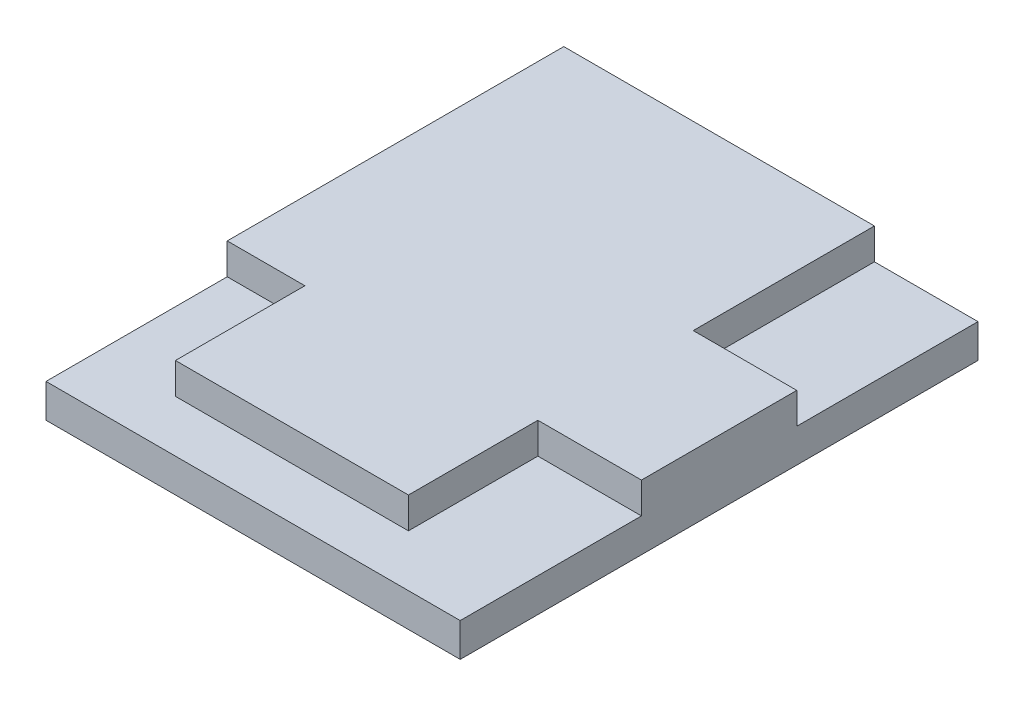
ISO-10303-21;
HEADER;
FILE_DESCRIPTION(('STEP AP214'),'2;1');
FILE_NAME('part.step','',(''),(''),'','','');
FILE_SCHEMA(('AUTOMOTIVE_DESIGN { 1 0 10303 214 1 1 1 1 }'));
ENDSEC;
DATA;
#1=APPLICATION_CONTEXT('core data for automotive mechanical design processes');
#2=APPLICATION_PROTOCOL_DEFINITION('international standard','automotive_design',2000,#1);
#3=PRODUCT_CONTEXT('',#1,'mechanical');
#4=PRODUCT('Part','Part','',(#3));
#5=PRODUCT_RELATED_PRODUCT_CATEGORY('part','',(#4));
#6=PRODUCT_DEFINITION_FORMATION('','',#4);
#7=PRODUCT_DEFINITION_CONTEXT('part definition',#1,'design');
#8=PRODUCT_DEFINITION('design','',#6,#7);
#9=PRODUCT_DEFINITION_SHAPE('','',#8);
#10=(LENGTH_UNIT() NAMED_UNIT(*) SI_UNIT(.MILLI.,.METRE.));
#11=(NAMED_UNIT(*) PLANE_ANGLE_UNIT() SI_UNIT($,.RADIAN.));
#12=(NAMED_UNIT(*) SI_UNIT($,.STERADIAN.) SOLID_ANGLE_UNIT());
#13=UNCERTAINTY_MEASURE_WITH_UNIT(LENGTH_MEASURE(1.E-05),#10,'distance_accuracy_value','');
#14=(GEOMETRIC_REPRESENTATION_CONTEXT(3) GLOBAL_UNCERTAINTY_ASSIGNED_CONTEXT((#13)) GLOBAL_UNIT_ASSIGNED_CONTEXT((#10,
#11,#12)) REPRESENTATION_CONTEXT('',''));
#15=CARTESIAN_POINT('',(0.,0.,0.));
#16=DIRECTION('',(0.,0.,1.));
#17=DIRECTION('',(1.,0.,0.));
#18=AXIS2_PLACEMENT_3D('',#15,#16,#17);
#19=CARTESIAN_POINT('',(0.,1.3,0.));
#20=DIRECTION('',(0.,-1.,0.));
#21=DIRECTION('',(0.,0.,-1.));
#22=AXIS2_PLACEMENT_3D('',#19,#20,#21);
#23=PLANE('',#22);
#24=DIRECTION('',(0.,0.,-1.));
#25=VECTOR('',#24,1.);
#26=CARTESIAN_POINT('',(12.,1.3,-20.));
#27=LINE('',#26,#25);
#28=CARTESIAN_POINT('',(12.,1.3,-13.));
#29=VERTEX_POINT('',#28);
#30=CARTESIAN_POINT('',(12.,1.3,-20.));
#31=VERTEX_POINT('',#30);
#32=EDGE_CURVE('E61',#29,#31,#27,.T.);
#33=ORIENTED_EDGE('',*,*,#32,.F.);
#34=DIRECTION('',(-1.,0.,0.));
#35=VECTOR('',#34,1.);
#36=CARTESIAN_POINT('',(12.,1.3,-13.));
#37=LINE('',#36,#35);
#38=CARTESIAN_POINT('',(16.,1.3,-13.));
#39=VERTEX_POINT('',#38);
#40=EDGE_CURVE('E244',#39,#29,#37,.T.);
#41=ORIENTED_EDGE('',*,*,#40,.F.);
#42=DIRECTION('',(0.,0.,-1.));
#43=VECTOR('',#42,1.);
#44=CARTESIAN_POINT('',(16.,1.3,0.));
#45=LINE('',#44,#43);
#46=CARTESIAN_POINT('',(16.,1.3,-20.));
#47=VERTEX_POINT('',#46);
#48=EDGE_CURVE('E185',#39,#47,#45,.T.);
#49=ORIENTED_EDGE('',*,*,#48,.T.);
#50=DIRECTION('',(-1.,0.,0.));
#51=VECTOR('',#50,1.);
#52=CARTESIAN_POINT('',(0.,1.3,-20.));
#53=LINE('',#52,#51);
#54=EDGE_CURVE('E189',#47,#31,#53,.T.);
#55=ORIENTED_EDGE('',*,*,#54,.T.);
#56=EDGE_LOOP('',(#33,#41,#49,#55));
#57=FACE_BOUND('',#56,.T.);
#58=ADVANCED_FACE('F45',(#57),#23,.F.);
#59=DIRECTION('',(1.,0.,0.));
#60=VECTOR('',#59,1.);
#61=CARTESIAN_POINT('',(16.,1.3,-7.));
#62=LINE('',#61,#60);
#63=CARTESIAN_POINT('',(12.,1.3,-7.));
#64=VERTEX_POINT('',#63);
#65=CARTESIAN_POINT('',(16.,1.3,-7.));
#66=VERTEX_POINT('',#65);
#67=EDGE_CURVE('E69',#64,#66,#62,.T.);
#68=ORIENTED_EDGE('',*,*,#67,.F.);
#69=DIRECTION('',(0.,0.,-1.));
#70=VECTOR('',#69,1.);
#71=CARTESIAN_POINT('',(12.,1.3,-7.));
#72=LINE('',#71,#70);
#73=CARTESIAN_POINT('',(12.,1.3,-2.));
#74=VERTEX_POINT('',#73);
#75=EDGE_CURVE('E239',#74,#64,#72,.T.);
#76=ORIENTED_EDGE('',*,*,#75,.F.);
#77=DIRECTION('',(1.,0.,0.));
#78=VECTOR('',#77,1.);
#79=CARTESIAN_POINT('',(3.,1.3,-2.));
#80=LINE('',#79,#78);
#81=CARTESIAN_POINT('',(3.,1.3,-2.));
#82=VERTEX_POINT('',#81);
#83=EDGE_CURVE('E231',#82,#74,#80,.T.);
#84=ORIENTED_EDGE('',*,*,#83,.F.);
#85=DIRECTION('',(0.,0.,1.));
#86=VECTOR('',#85,1.);
#87=CARTESIAN_POINT('',(3.,1.3,-7.));
#88=LINE('',#87,#86);
#89=CARTESIAN_POINT('',(3.,1.3,-7.));
#90=VERTEX_POINT('',#89);
#91=EDGE_CURVE('E227',#90,#82,#88,.T.);
#92=ORIENTED_EDGE('',*,*,#91,.F.);
#93=DIRECTION('',(1.,0.,0.));
#94=VECTOR('',#93,1.);
#95=CARTESIAN_POINT('',(0.,1.3,-7.));
#96=LINE('',#95,#94);
#97=CARTESIAN_POINT('',(0.,1.3,-7.));
#98=VERTEX_POINT('',#97);
#99=EDGE_CURVE('E225',#98,#90,#96,.T.);
#100=ORIENTED_EDGE('',*,*,#99,.F.);
#101=DIRECTION('',(0.,0.,1.));
#102=VECTOR('',#101,1.);
#103=CARTESIAN_POINT('',(0.,1.3,0.));
#104=LINE('',#103,#102);
#105=CARTESIAN_POINT('',(0.,1.3,0.));
#106=VERTEX_POINT('',#105);
#107=EDGE_CURVE('E167',#98,#106,#104,.T.);
#108=ORIENTED_EDGE('',*,*,#107,.T.);
#109=DIRECTION('',(1.,0.,0.));
#110=VECTOR('',#109,1.);
#111=CARTESIAN_POINT('',(0.,1.3,0.));
#112=LINE('',#111,#110);
#113=CARTESIAN_POINT('',(16.,1.3,0.));
#114=VERTEX_POINT('',#113);
#115=EDGE_CURVE('E181',#106,#114,#112,.T.);
#116=ORIENTED_EDGE('',*,*,#115,.T.);
#117=EDGE_CURVE('E186',#114,#66,#45,.T.);
#118=ORIENTED_EDGE('',*,*,#117,.T.);
#119=EDGE_LOOP('',(#68,#76,#84,#92,#100,#108,#116,#118));
#120=FACE_BOUND('',#119,.T.);
#121=ADVANCED_FACE('F224',(#120),#23,.F.);
#122=CARTESIAN_POINT('',(0.,1.3,0.));
#123=DIRECTION('',(1.,0.,0.));
#124=DIRECTION('',(0.,0.,-1.));
#125=AXIS2_PLACEMENT_3D('',#122,#123,#124);
#126=PLANE('',#125);
#127=DIRECTION('',(0.,0.,1.));
#128=VECTOR('',#127,1.);
#129=CARTESIAN_POINT('',(0.,0.,0.));
#130=LINE('',#129,#128);
#131=CARTESIAN_POINT('',(0.,0.,-20.));
#132=VERTEX_POINT('',#131);
#133=CARTESIAN_POINT('',(0.,0.,0.));
#134=VERTEX_POINT('',#133);
#135=EDGE_CURVE('E169',#132,#134,#130,.T.);
#136=ORIENTED_EDGE('',*,*,#135,.T.);
#137=DIRECTION('',(0.,-1.,0.));
#138=VECTOR('',#137,1.);
#139=CARTESIAN_POINT('',(0.,1.3,0.));
#140=LINE('',#139,#138);
#141=EDGE_CURVE('E11',#106,#134,#140,.T.);
#142=ORIENTED_EDGE('',*,*,#141,.F.);
#143=ORIENTED_EDGE('',*,*,#107,.F.);
#144=DIRECTION('',(0.,-1.,0.));
#145=VECTOR('',#144,1.);
#146=CARTESIAN_POINT('',(0.,2.5,-7.));
#147=LINE('',#146,#145);
#148=CARTESIAN_POINT('',(0.,2.5,-7.));
#149=VERTEX_POINT('',#148);
#150=EDGE_CURVE('E146',#149,#98,#147,.T.);
#151=ORIENTED_EDGE('',*,*,#150,.F.);
#152=DIRECTION('',(0.,0.,1.));
#153=VECTOR('',#152,1.);
#154=CARTESIAN_POINT('',(0.,2.5,-20.));
#155=LINE('',#154,#153);
#156=CARTESIAN_POINT('',(0.,2.5,-20.));
#157=VERTEX_POINT('',#156);
#158=EDGE_CURVE('E153',#157,#149,#155,.T.);
#159=ORIENTED_EDGE('',*,*,#158,.F.);
#160=DIRECTION('',(0.,-1.,0.));
#161=VECTOR('',#160,1.);
#162=CARTESIAN_POINT('',(0.,1.3,-20.));
#163=LINE('',#162,#161);
#164=EDGE_CURVE('E191',#157,#132,#163,.T.);
#165=ORIENTED_EDGE('',*,*,#164,.T.);
#166=EDGE_LOOP('',(#136,#142,#143,#151,#159,#165));
#167=FACE_BOUND('',#166,.T.);
#168=ADVANCED_FACE('F47',(#167),#126,.F.);
#169=CARTESIAN_POINT('',(0.,1.3,0.));
#170=DIRECTION('',(0.,0.,-1.));
#171=DIRECTION('',(-1.,0.,0.));
#172=AXIS2_PLACEMENT_3D('',#169,#170,#171);
#173=PLANE('',#172);
#174=DIRECTION('',(1.,0.,0.));
#175=VECTOR('',#174,1.);
#176=CARTESIAN_POINT('',(0.,0.,0.));
#177=LINE('',#176,#175);
#178=CARTESIAN_POINT('',(16.,0.,0.));
#179=VERTEX_POINT('',#178);
#180=EDGE_CURVE('E173',#134,#179,#177,.T.);
#181=ORIENTED_EDGE('',*,*,#180,.T.);
#182=DIRECTION('',(0.,-1.,0.));
#183=VECTOR('',#182,1.);
#184=CARTESIAN_POINT('',(16.,1.3,0.));
#185=LINE('',#184,#183);
#186=EDGE_CURVE('E54',#114,#179,#185,.T.);
#187=ORIENTED_EDGE('',*,*,#186,.F.);
#188=ORIENTED_EDGE('',*,*,#115,.F.);
#189=ORIENTED_EDGE('',*,*,#141,.T.);
#190=EDGE_LOOP('',(#181,#187,#188,#189));
#191=FACE_BOUND('',#190,.T.);
#192=ADVANCED_FACE('F223',(#191),#173,.F.);
#193=CARTESIAN_POINT('',(16.,1.3,0.));
#194=DIRECTION('',(-1.,0.,0.));
#195=DIRECTION('',(0.,0.,1.));
#196=AXIS2_PLACEMENT_3D('',#193,#194,#195);
#197=PLANE('',#196);
#198=DIRECTION('',(0.,0.,-1.));
#199=VECTOR('',#198,1.);
#200=CARTESIAN_POINT('',(16.,0.,0.));
#201=LINE('',#200,#199);
#202=CARTESIAN_POINT('',(16.,0.,-20.));
#203=VERTEX_POINT('',#202);
#204=EDGE_CURVE('E195',#179,#203,#201,.T.);
#205=ORIENTED_EDGE('',*,*,#204,.T.);
#206=DIRECTION('',(0.,-1.,0.));
#207=VECTOR('',#206,1.);
#208=CARTESIAN_POINT('',(16.,1.3,-20.));
#209=LINE('',#208,#207);
#210=EDGE_CURVE('E202',#47,#203,#209,.T.);
#211=ORIENTED_EDGE('',*,*,#210,.F.);
#212=ORIENTED_EDGE('',*,*,#48,.F.);
#213=DIRECTION('',(0.,-1.,0.));
#214=VECTOR('',#213,1.);
#215=CARTESIAN_POINT('',(16.,2.5,-13.));
#216=LINE('',#215,#214);
#217=CARTESIAN_POINT('',(16.,2.5,-13.));
#218=VERTEX_POINT('',#217);
#219=EDGE_CURVE('E257',#218,#39,#216,.T.);
#220=ORIENTED_EDGE('',*,*,#219,.F.);
#221=DIRECTION('',(0.,0.,-1.));
#222=VECTOR('',#221,1.);
#223=CARTESIAN_POINT('',(16.,2.5,-13.));
#224=LINE('',#223,#222);
#225=CARTESIAN_POINT('',(16.,2.5,-7.));
#226=VERTEX_POINT('',#225);
#227=EDGE_CURVE('E292',#226,#218,#224,.T.);
#228=ORIENTED_EDGE('',*,*,#227,.F.);
#229=DIRECTION('',(0.,-1.,0.));
#230=VECTOR('',#229,1.);
#231=CARTESIAN_POINT('',(16.,2.5,-7.));
#232=LINE('',#231,#230);
#233=EDGE_CURVE('E261',#226,#66,#232,.T.);
#234=ORIENTED_EDGE('',*,*,#233,.T.);
#235=ORIENTED_EDGE('',*,*,#117,.F.);
#236=ORIENTED_EDGE('',*,*,#186,.T.);
#237=EDGE_LOOP('',(#205,#211,#212,#220,#228,#234,#235,#236));
#238=FACE_BOUND('',#237,.T.);
#239=ADVANCED_FACE('F211',(#238),#197,.F.);
#240=CARTESIAN_POINT('',(0.,1.3,-20.));
#241=DIRECTION('',(0.,0.,1.));
#242=DIRECTION('',(1.,0.,0.));
#243=AXIS2_PLACEMENT_3D('',#240,#241,#242);
#244=PLANE('',#243);
#245=DIRECTION('',(-1.,0.,0.));
#246=VECTOR('',#245,1.);
#247=CARTESIAN_POINT('',(0.,0.,-20.));
#248=LINE('',#247,#246);
#249=EDGE_CURVE('E182',#203,#132,#248,.T.);
#250=ORIENTED_EDGE('',*,*,#249,.T.);
#251=ORIENTED_EDGE('',*,*,#164,.F.);
#252=DIRECTION('',(-1.,0.,0.));
#253=VECTOR('',#252,1.);
#254=CARTESIAN_POINT('',(0.,2.5,-20.));
#255=LINE('',#254,#253);
#256=CARTESIAN_POINT('',(12.,2.5,-20.));
#257=VERTEX_POINT('',#256);
#258=EDGE_CURVE('E159',#257,#157,#255,.T.);
#259=ORIENTED_EDGE('',*,*,#258,.F.);
#260=DIRECTION('',(0.,-1.,0.));
#261=VECTOR('',#260,1.);
#262=CARTESIAN_POINT('',(12.,2.5,-20.));
#263=LINE('',#262,#261);
#264=EDGE_CURVE('E249',#257,#31,#263,.T.);
#265=ORIENTED_EDGE('',*,*,#264,.T.);
#266=ORIENTED_EDGE('',*,*,#54,.F.);
#267=ORIENTED_EDGE('',*,*,#210,.T.);
#268=EDGE_LOOP('',(#250,#251,#259,#265,#266,#267));
#269=FACE_BOUND('',#268,.T.);
#270=ADVANCED_FACE('F221',(#269),#244,.F.);
#271=CARTESIAN_POINT('',(0.,0.,0.));
#272=DIRECTION('',(0.,-1.,0.));
#273=DIRECTION('',(0.,0.,-1.));
#274=AXIS2_PLACEMENT_3D('',#271,#272,#273);
#275=PLANE('',#274);
#276=ORIENTED_EDGE('',*,*,#135,.F.);
#277=ORIENTED_EDGE('',*,*,#249,.F.);
#278=ORIENTED_EDGE('',*,*,#204,.F.);
#279=ORIENTED_EDGE('',*,*,#180,.F.);
#280=EDGE_LOOP('',(#276,#277,#278,#279));
#281=FACE_BOUND('',#280,.T.);
#282=ADVANCED_FACE('F219',(#281),#275,.T.);
#283=CARTESIAN_POINT('',(0.,2.5,-7.));
#284=DIRECTION('',(0.,0.,-1.));
#285=DIRECTION('',(-1.,0.,0.));
#286=AXIS2_PLACEMENT_3D('',#283,#284,#285);
#287=PLANE('',#286);
#288=ORIENTED_EDGE('',*,*,#99,.T.);
#289=DIRECTION('',(0.,-1.,0.));
#290=VECTOR('',#289,1.);
#291=CARTESIAN_POINT('',(3.,2.5,-7.));
#292=LINE('',#291,#290);
#293=CARTESIAN_POINT('',(3.,2.5,-7.));
#294=VERTEX_POINT('',#293);
#295=EDGE_CURVE('E148',#294,#90,#292,.T.);
#296=ORIENTED_EDGE('',*,*,#295,.F.);
#297=DIRECTION('',(1.,0.,0.));
#298=VECTOR('',#297,1.);
#299=CARTESIAN_POINT('',(0.,2.5,-7.));
#300=LINE('',#299,#298);
#301=EDGE_CURVE('E141',#149,#294,#300,.T.);
#302=ORIENTED_EDGE('',*,*,#301,.F.);
#303=ORIENTED_EDGE('',*,*,#150,.T.);
#304=EDGE_LOOP('',(#288,#296,#302,#303));
#305=FACE_BOUND('',#304,.T.);
#306=ADVANCED_FACE('F144',(#305),#287,.F.);
#307=CARTESIAN_POINT('',(3.,2.5,-7.));
#308=DIRECTION('',(1.,0.,0.));
#309=DIRECTION('',(0.,0.,-1.));
#310=AXIS2_PLACEMENT_3D('',#307,#308,#309);
#311=PLANE('',#310);
#312=ORIENTED_EDGE('',*,*,#91,.T.);
#313=DIRECTION('',(0.,-1.,0.));
#314=VECTOR('',#313,1.);
#315=CARTESIAN_POINT('',(3.,2.5,-2.));
#316=LINE('',#315,#314);
#317=CARTESIAN_POINT('',(3.,2.5,-2.));
#318=VERTEX_POINT('',#317);
#319=EDGE_CURVE('E175',#318,#82,#316,.T.);
#320=ORIENTED_EDGE('',*,*,#319,.F.);
#321=DIRECTION('',(0.,0.,1.));
#322=VECTOR('',#321,1.);
#323=CARTESIAN_POINT('',(3.,2.5,-7.));
#324=LINE('',#323,#322);
#325=EDGE_CURVE('E152',#294,#318,#324,.T.);
#326=ORIENTED_EDGE('',*,*,#325,.F.);
#327=ORIENTED_EDGE('',*,*,#295,.T.);
#328=EDGE_LOOP('',(#312,#320,#326,#327));
#329=FACE_BOUND('',#328,.T.);
#330=ADVANCED_FACE('F280',(#329),#311,.F.);
#331=CARTESIAN_POINT('',(3.,2.5,-2.));
#332=DIRECTION('',(0.,0.,-1.));
#333=DIRECTION('',(-1.,0.,0.));
#334=AXIS2_PLACEMENT_3D('',#331,#332,#333);
#335=PLANE('',#334);
#336=ORIENTED_EDGE('',*,*,#83,.T.);
#337=DIRECTION('',(0.,-1.,0.));
#338=VECTOR('',#337,1.);
#339=CARTESIAN_POINT('',(12.,2.5,-2.));
#340=LINE('',#339,#338);
#341=CARTESIAN_POINT('',(12.,2.5,-2.));
#342=VERTEX_POINT('',#341);
#343=EDGE_CURVE('E268',#342,#74,#340,.T.);
#344=ORIENTED_EDGE('',*,*,#343,.F.);
#345=DIRECTION('',(1.,0.,0.));
#346=VECTOR('',#345,1.);
#347=CARTESIAN_POINT('',(3.,2.5,-2.));
#348=LINE('',#347,#346);
#349=EDGE_CURVE('E278',#318,#342,#348,.T.);
#350=ORIENTED_EDGE('',*,*,#349,.F.);
#351=ORIENTED_EDGE('',*,*,#319,.T.);
#352=EDGE_LOOP('',(#336,#344,#350,#351));
#353=FACE_BOUND('',#352,.T.);
#354=ADVANCED_FACE('F276',(#353),#335,.F.);
#355=CARTESIAN_POINT('',(12.,2.5,-7.));
#356=DIRECTION('',(-1.,0.,0.));
#357=DIRECTION('',(0.,0.,1.));
#358=AXIS2_PLACEMENT_3D('',#355,#356,#357);
#359=PLANE('',#358);
#360=ORIENTED_EDGE('',*,*,#75,.T.);
#361=DIRECTION('',(0.,-1.,0.));
#362=VECTOR('',#361,1.);
#363=CARTESIAN_POINT('',(12.,2.5,-7.));
#364=LINE('',#363,#362);
#365=CARTESIAN_POINT('',(12.,2.5,-7.));
#366=VERTEX_POINT('',#365);
#367=EDGE_CURVE('E264',#366,#64,#364,.T.);
#368=ORIENTED_EDGE('',*,*,#367,.F.);
#369=DIRECTION('',(0.,0.,-1.));
#370=VECTOR('',#369,1.);
#371=CARTESIAN_POINT('',(12.,2.5,-7.));
#372=LINE('',#371,#370);
#373=EDGE_CURVE('E284',#342,#366,#372,.T.);
#374=ORIENTED_EDGE('',*,*,#373,.F.);
#375=ORIENTED_EDGE('',*,*,#343,.T.);
#376=EDGE_LOOP('',(#360,#368,#374,#375));
#377=FACE_BOUND('',#376,.T.);
#378=ADVANCED_FACE('F320',(#377),#359,.F.);
#379=CARTESIAN_POINT('',(16.,2.5,-7.));
#380=DIRECTION('',(0.,0.,-1.));
#381=DIRECTION('',(-1.,0.,0.));
#382=AXIS2_PLACEMENT_3D('',#379,#380,#381);
#383=PLANE('',#382);
#384=ORIENTED_EDGE('',*,*,#67,.T.);
#385=ORIENTED_EDGE('',*,*,#233,.F.);
#386=DIRECTION('',(1.,0.,0.));
#387=VECTOR('',#386,1.);
#388=CARTESIAN_POINT('',(16.,2.5,-7.));
#389=LINE('',#388,#387);
#390=EDGE_CURVE('E289',#366,#226,#389,.T.);
#391=ORIENTED_EDGE('',*,*,#390,.F.);
#392=ORIENTED_EDGE('',*,*,#367,.T.);
#393=EDGE_LOOP('',(#384,#385,#391,#392));
#394=FACE_BOUND('',#393,.T.);
#395=ADVANCED_FACE('F313',(#394),#383,.F.);
#396=CARTESIAN_POINT('',(12.,2.5,-13.));
#397=DIRECTION('',(0.,0.,1.));
#398=DIRECTION('',(1.,0.,0.));
#399=AXIS2_PLACEMENT_3D('',#396,#397,#398);
#400=PLANE('',#399);
#401=ORIENTED_EDGE('',*,*,#40,.T.);
#402=DIRECTION('',(0.,-1.,0.));
#403=VECTOR('',#402,1.);
#404=CARTESIAN_POINT('',(12.,2.5,-13.));
#405=LINE('',#404,#403);
#406=CARTESIAN_POINT('',(12.,2.5,-13.));
#407=VERTEX_POINT('',#406);
#408=EDGE_CURVE('E253',#407,#29,#405,.T.);
#409=ORIENTED_EDGE('',*,*,#408,.F.);
#410=DIRECTION('',(-1.,0.,0.));
#411=VECTOR('',#410,1.);
#412=CARTESIAN_POINT('',(12.,2.5,-13.));
#413=LINE('',#412,#411);
#414=EDGE_CURVE('E295',#218,#407,#413,.T.);
#415=ORIENTED_EDGE('',*,*,#414,.F.);
#416=ORIENTED_EDGE('',*,*,#219,.T.);
#417=EDGE_LOOP('',(#401,#409,#415,#416));
#418=FACE_BOUND('',#417,.T.);
#419=ADVANCED_FACE('F311',(#418),#400,.F.);
#420=CARTESIAN_POINT('',(12.,2.5,-20.));
#421=DIRECTION('',(-1.,0.,0.));
#422=DIRECTION('',(0.,0.,1.));
#423=AXIS2_PLACEMENT_3D('',#420,#421,#422);
#424=PLANE('',#423);
#425=ORIENTED_EDGE('',*,*,#32,.T.);
#426=ORIENTED_EDGE('',*,*,#264,.F.);
#427=DIRECTION('',(0.,0.,-1.));
#428=VECTOR('',#427,1.);
#429=CARTESIAN_POINT('',(12.,2.5,-20.));
#430=LINE('',#429,#428);
#431=EDGE_CURVE('E297',#407,#257,#430,.T.);
#432=ORIENTED_EDGE('',*,*,#431,.F.);
#433=ORIENTED_EDGE('',*,*,#408,.T.);
#434=EDGE_LOOP('',(#425,#426,#432,#433));
#435=FACE_BOUND('',#434,.T.);
#436=ADVANCED_FACE('F305',(#435),#424,.F.);
#437=CARTESIAN_POINT('',(0.,2.5,0.));
#438=DIRECTION('',(0.,1.,0.));
#439=DIRECTION('',(0.,0.,1.));
#440=AXIS2_PLACEMENT_3D('',#437,#438,#439);
#441=PLANE('',#440);
#442=ORIENTED_EDGE('',*,*,#158,.T.);
#443=ORIENTED_EDGE('',*,*,#301,.T.);
#444=ORIENTED_EDGE('',*,*,#325,.T.);
#445=ORIENTED_EDGE('',*,*,#349,.T.);
#446=ORIENTED_EDGE('',*,*,#373,.T.);
#447=ORIENTED_EDGE('',*,*,#390,.T.);
#448=ORIENTED_EDGE('',*,*,#227,.T.);
#449=ORIENTED_EDGE('',*,*,#414,.T.);
#450=ORIENTED_EDGE('',*,*,#431,.T.);
#451=ORIENTED_EDGE('',*,*,#258,.T.);
#452=EDGE_LOOP('',(#442,#443,#444,#445,#446,#447,#448,#449,#450,#451));
#453=FACE_BOUND('',#452,.T.);
#454=ADVANCED_FACE('F157',(#453),#441,.T.);
#455=CLOSED_SHELL('',(#58,#121,#168,#192,#239,#270,#282,#306,#330,#354,#378,#395,#419,#436,#454));
#456=MANIFOLD_SOLID_BREP('B2',#455);
#457=ADVANCED_BREP_SHAPE_REPRESENTATION('',(#18,#456),#14);
#458=SHAPE_DEFINITION_REPRESENTATION(#9,#457);
ENDSEC;
END-ISO-10303-21;
